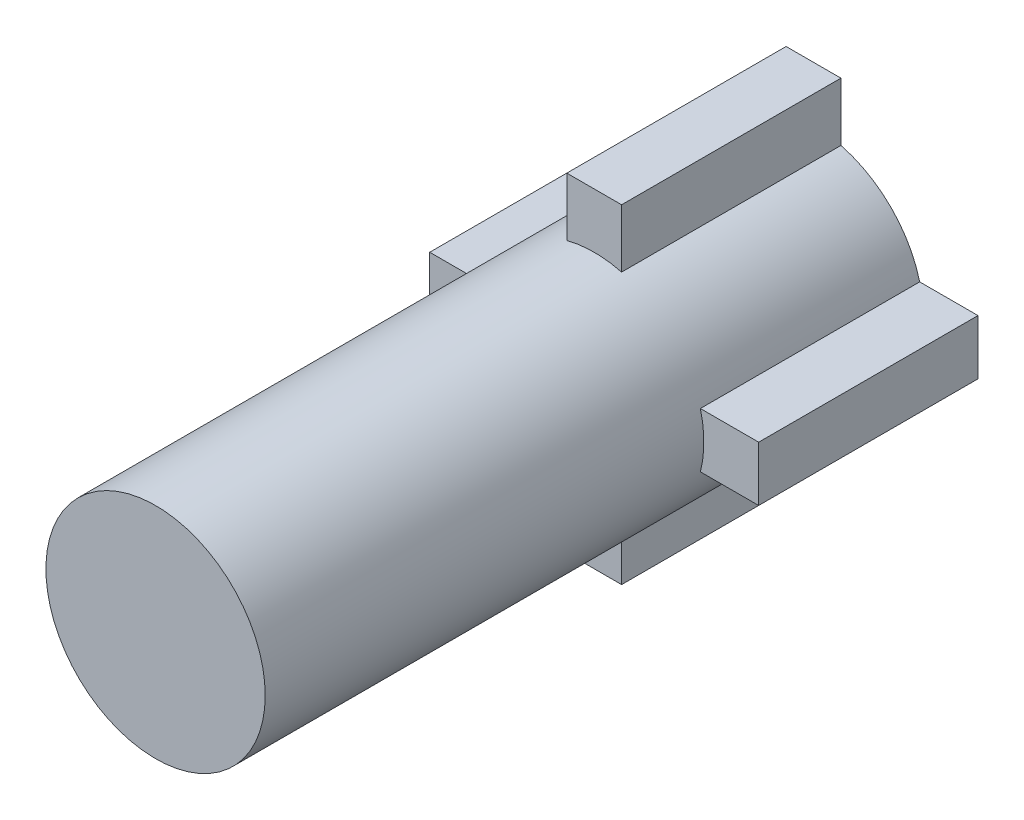
ISO-10303-21;
HEADER;
FILE_DESCRIPTION(('STEP AP214'),'2;1');
FILE_NAME('part.step','',(''),(''),'','','');
FILE_SCHEMA(('AUTOMOTIVE_DESIGN { 1 0 10303 214 1 1 1 1 }'));
ENDSEC;
DATA;
#1=APPLICATION_CONTEXT('core data for automotive mechanical design processes');
#2=APPLICATION_PROTOCOL_DEFINITION('international standard','automotive_design',2000,#1);
#3=PRODUCT_CONTEXT('',#1,'mechanical');
#4=PRODUCT('Part','Part','',(#3));
#5=PRODUCT_RELATED_PRODUCT_CATEGORY('part','',(#4));
#6=PRODUCT_DEFINITION_FORMATION('','',#4);
#7=PRODUCT_DEFINITION_CONTEXT('part definition',#1,'design');
#8=PRODUCT_DEFINITION('design','',#6,#7);
#9=PRODUCT_DEFINITION_SHAPE('','',#8);
#10=(LENGTH_UNIT() NAMED_UNIT(*) SI_UNIT(.MILLI.,.METRE.));
#11=(NAMED_UNIT(*) PLANE_ANGLE_UNIT() SI_UNIT($,.RADIAN.));
#12=(NAMED_UNIT(*) SI_UNIT($,.STERADIAN.) SOLID_ANGLE_UNIT());
#13=UNCERTAINTY_MEASURE_WITH_UNIT(LENGTH_MEASURE(1.E-05),#10,'distance_accuracy_value','');
#14=(GEOMETRIC_REPRESENTATION_CONTEXT(3) GLOBAL_UNCERTAINTY_ASSIGNED_CONTEXT((#13)) GLOBAL_UNIT_ASSIGNED_CONTEXT((#10,
#11,#12)) REPRESENTATION_CONTEXT('',''));
#15=CARTESIAN_POINT('',(0.,0.,0.));
#16=DIRECTION('',(0.,0.,1.));
#17=DIRECTION('',(1.,0.,0.));
#18=AXIS2_PLACEMENT_3D('',#15,#16,#17);
#19=CARTESIAN_POINT('',(0.,0.,0.3));
#20=DIRECTION('',(0.,0.,-1.));
#21=DIRECTION('',(-1.,0.,0.));
#22=AXIS2_PLACEMENT_3D('',#19,#20,#21);
#23=CYLINDRICAL_SURFACE('',#22,0.100000000000003);
#24=CARTESIAN_POINT('',(0.,0.,-0.3));
#25=DIRECTION('',(0.,0.,1.));
#26=DIRECTION('',(1.,0.,0.));
#27=AXIS2_PLACEMENT_3D('',#24,#25,#26);
#28=CIRCLE('',#27,0.100000000000003);
#29=CARTESIAN_POINT('',(-0.0968245836551884,-0.025,-0.3));
#30=VERTEX_POINT('',#29);
#31=CARTESIAN_POINT('',(-0.025,-0.0968245836551884,-0.3));
#32=VERTEX_POINT('',#31);
#33=EDGE_CURVE('E342',#30,#32,#28,.T.);
#34=ORIENTED_EDGE('',*,*,#33,.T.);
#35=DIRECTION('',(0.,0.,-1.));
#36=VECTOR('',#35,1.);
#37=CARTESIAN_POINT('',(-0.025,-0.0968245836551884,0.3));
#38=LINE('',#37,#36);
#39=CARTESIAN_POINT('',(-0.025,-0.0968245836551884,-0.1));
#40=VERTEX_POINT('',#39);
#41=EDGE_CURVE('E60',#32,#40,#38,.F.);
#42=ORIENTED_EDGE('',*,*,#41,.T.);
#43=CARTESIAN_POINT('',(0.,0.,-0.1));
#44=DIRECTION('',(0.,0.,-1.));
#45=DIRECTION('',(-1.,0.,0.));
#46=AXIS2_PLACEMENT_3D('',#43,#44,#45);
#47=CIRCLE('',#46,0.100000000000003);
#48=CARTESIAN_POINT('',(0.025,-0.0968245836551884,-0.1));
#49=VERTEX_POINT('',#48);
#50=EDGE_CURVE('E11',#49,#40,#47,.T.);
#51=ORIENTED_EDGE('',*,*,#50,.F.);
#52=DIRECTION('',(0.,0.,-1.));
#53=VECTOR('',#52,1.);
#54=CARTESIAN_POINT('',(0.025,-0.0968245836551884,0.3));
#55=LINE('',#54,#53);
#56=CARTESIAN_POINT('',(0.025,-0.0968245836551884,-0.3));
#57=VERTEX_POINT('',#56);
#58=EDGE_CURVE('E174',#49,#57,#55,.T.);
#59=ORIENTED_EDGE('',*,*,#58,.T.);
#60=CARTESIAN_POINT('',(0.0968245836551884,-0.025,-0.3));
#61=VERTEX_POINT('',#60);
#62=EDGE_CURVE('E306',#57,#61,#28,.T.);
#63=ORIENTED_EDGE('',*,*,#62,.T.);
#64=DIRECTION('',(0.,0.,-1.));
#65=VECTOR('',#64,1.);
#66=CARTESIAN_POINT('',(0.0968245836551884,-0.025,0.3));
#67=LINE('',#66,#65);
#68=CARTESIAN_POINT('',(0.0968245836551884,-0.025,-0.1));
#69=VERTEX_POINT('',#68);
#70=EDGE_CURVE('E303',#61,#69,#67,.F.);
#71=ORIENTED_EDGE('',*,*,#70,.T.);
#72=CARTESIAN_POINT('',(0.,0.,-0.1));
#73=DIRECTION('',(0.,0.,-1.));
#74=DIRECTION('',(-1.,0.,0.));
#75=AXIS2_PLACEMENT_3D('',#72,#73,#74);
#76=CIRCLE('',#75,0.100000000000003);
#77=CARTESIAN_POINT('',(0.0968245836551884,0.025,-0.1));
#78=VERTEX_POINT('',#77);
#79=EDGE_CURVE('E311',#78,#69,#76,.T.);
#80=ORIENTED_EDGE('',*,*,#79,.F.);
#81=DIRECTION('',(0.,0.,-1.));
#82=VECTOR('',#81,1.);
#83=CARTESIAN_POINT('',(0.0968245836551884,0.025,0.3));
#84=LINE('',#83,#82);
#85=CARTESIAN_POINT('',(0.0968245836551884,0.025,-0.3));
#86=VERTEX_POINT('',#85);
#87=EDGE_CURVE('E296',#78,#86,#84,.T.);
#88=ORIENTED_EDGE('',*,*,#87,.T.);
#89=CARTESIAN_POINT('',(0.025,0.0968245836551884,-0.3));
#90=VERTEX_POINT('',#89);
#91=EDGE_CURVE('E312',#86,#90,#28,.T.);
#92=ORIENTED_EDGE('',*,*,#91,.T.);
#93=DIRECTION('',(0.,0.,-1.));
#94=VECTOR('',#93,1.);
#95=CARTESIAN_POINT('',(0.025,0.0968245836551884,0.3));
#96=LINE('',#95,#94);
#97=CARTESIAN_POINT('',(0.025,0.0968245836551884,-0.1));
#98=VERTEX_POINT('',#97);
#99=EDGE_CURVE('E267',#90,#98,#96,.F.);
#100=ORIENTED_EDGE('',*,*,#99,.T.);
#101=CARTESIAN_POINT('',(0.,0.,-0.1));
#102=DIRECTION('',(0.,0.,-1.));
#103=DIRECTION('',(-1.,0.,0.));
#104=AXIS2_PLACEMENT_3D('',#101,#102,#103);
#105=CIRCLE('',#104,0.100000000000003);
#106=CARTESIAN_POINT('',(-0.025,0.0968245836551884,-0.1));
#107=VERTEX_POINT('',#106);
#108=EDGE_CURVE('E319',#107,#98,#105,.T.);
#109=ORIENTED_EDGE('',*,*,#108,.F.);
#110=DIRECTION('',(0.,0.,-1.));
#111=VECTOR('',#110,1.);
#112=CARTESIAN_POINT('',(-0.025,0.0968245836551884,0.3));
#113=LINE('',#112,#111);
#114=CARTESIAN_POINT('',(-0.025,0.0968245836551884,-0.3));
#115=VERTEX_POINT('',#114);
#116=EDGE_CURVE('E254',#107,#115,#113,.T.);
#117=ORIENTED_EDGE('',*,*,#116,.T.);
#118=CARTESIAN_POINT('',(-0.0968245836551884,0.025,-0.3));
#119=VERTEX_POINT('',#118);
#120=EDGE_CURVE('E315',#115,#119,#28,.T.);
#121=ORIENTED_EDGE('',*,*,#120,.T.);
#122=DIRECTION('',(0.,0.,-1.));
#123=VECTOR('',#122,1.);
#124=CARTESIAN_POINT('',(-0.0968245836551884,0.025,0.3));
#125=LINE('',#124,#123);
#126=CARTESIAN_POINT('',(-0.0968245836551884,0.025,-0.1));
#127=VERTEX_POINT('',#126);
#128=EDGE_CURVE('E231',#119,#127,#125,.F.);
#129=ORIENTED_EDGE('',*,*,#128,.T.);
#130=CARTESIAN_POINT('',(0.,0.,-0.1));
#131=DIRECTION('',(0.,0.,-1.));
#132=DIRECTION('',(-1.,0.,0.));
#133=AXIS2_PLACEMENT_3D('',#130,#131,#132);
#134=CIRCLE('',#133,0.100000000000003);
#135=CARTESIAN_POINT('',(-0.0968245836551884,-0.025,-0.1));
#136=VERTEX_POINT('',#135);
#137=EDGE_CURVE('E53',#136,#127,#134,.T.);
#138=ORIENTED_EDGE('',*,*,#137,.F.);
#139=DIRECTION('',(0.,0.,-1.));
#140=VECTOR('',#139,1.);
#141=CARTESIAN_POINT('',(-0.0968245836551884,-0.025,0.3));
#142=LINE('',#141,#140);
#143=EDGE_CURVE('E218',#136,#30,#142,.T.);
#144=ORIENTED_EDGE('',*,*,#143,.T.);
#145=EDGE_LOOP('',(#34,#42,#51,#59,#63,#71,#80,#88,#92,#100,#109,#117,#121,#129,#138,#144));
#146=FACE_BOUND('',#145,.T.);
#147=CARTESIAN_POINT('',(0.,0.,0.3));
#148=DIRECTION('',(0.,0.,1.));
#149=DIRECTION('',(1.,0.,0.));
#150=AXIS2_PLACEMENT_3D('',#147,#148,#149);
#151=CIRCLE('',#150,0.100000000000003);
#152=CARTESIAN_POINT('',(0.100000000000003,0.,0.3));
#153=VERTEX_POINT('',#152);
#154=EDGE_CURVE('E307',#153,#153,#151,.T.);
#155=ORIENTED_EDGE('',*,*,#154,.F.);
#156=EDGE_LOOP('',(#155));
#157=FACE_BOUND('',#156,.T.);
#158=ADVANCED_FACE('F45',(#146,#157),#23,.T.);
#159=CARTESIAN_POINT('',(0.,0.,0.3));
#160=DIRECTION('',(0.,0.,1.));
#161=DIRECTION('',(1.,0.,0.));
#162=AXIS2_PLACEMENT_3D('',#159,#160,#161);
#163=PLANE('',#162);
#164=ORIENTED_EDGE('',*,*,#154,.T.);
#165=EDGE_LOOP('',(#164));
#166=FACE_BOUND('',#165,.T.);
#167=ADVANCED_FACE('F372',(#166),#163,.T.);
#168=CARTESIAN_POINT('',(0.,0.,-0.3));
#169=DIRECTION('',(0.,0.,1.));
#170=DIRECTION('',(1.,0.,0.));
#171=AXIS2_PLACEMENT_3D('',#168,#169,#170);
#172=PLANE('',#171);
#173=ORIENTED_EDGE('',*,*,#62,.F.);
#174=DIRECTION('',(0.,-1.,0.));
#175=VECTOR('',#174,1.);
#176=CARTESIAN_POINT('',(0.025,-0.150000000000003,-0.3));
#177=LINE('',#176,#175);
#178=CARTESIAN_POINT('',(0.025,-0.150000000000003,-0.3));
#179=VERTEX_POINT('',#178);
#180=EDGE_CURVE('E175',#57,#179,#177,.T.);
#181=ORIENTED_EDGE('',*,*,#180,.T.);
#182=DIRECTION('',(-1.,0.,0.));
#183=VECTOR('',#182,1.);
#184=CARTESIAN_POINT('',(-0.0250000000000001,-0.150000000000003,-0.3));
#185=LINE('',#184,#183);
#186=CARTESIAN_POINT('',(-0.0250000000000001,-0.150000000000003,-0.3));
#187=VERTEX_POINT('',#186);
#188=EDGE_CURVE('E160',#179,#187,#185,.T.);
#189=ORIENTED_EDGE('',*,*,#188,.T.);
#190=DIRECTION('',(0.,1.,0.));
#191=VECTOR('',#190,1.);
#192=CARTESIAN_POINT('',(-0.0250000000000001,-0.150000000000003,-0.3));
#193=LINE('',#192,#191);
#194=EDGE_CURVE('E170',#187,#32,#193,.T.);
#195=ORIENTED_EDGE('',*,*,#194,.T.);
#196=ORIENTED_EDGE('',*,*,#33,.F.);
#197=DIRECTION('',(-1.,0.,0.));
#198=VECTOR('',#197,1.);
#199=CARTESIAN_POINT('',(-0.150000000000003,-0.025,-0.3));
#200=LINE('',#199,#198);
#201=CARTESIAN_POINT('',(-0.150000000000003,-0.025,-0.3));
#202=VERTEX_POINT('',#201);
#203=EDGE_CURVE('E210',#30,#202,#200,.T.);
#204=ORIENTED_EDGE('',*,*,#203,.T.);
#205=DIRECTION('',(0.,1.,0.));
#206=VECTOR('',#205,1.);
#207=CARTESIAN_POINT('',(-0.150000000000003,0.025,-0.3));
#208=LINE('',#207,#206);
#209=CARTESIAN_POINT('',(-0.150000000000003,0.025,-0.3));
#210=VERTEX_POINT('',#209);
#211=EDGE_CURVE('E206',#202,#210,#208,.T.);
#212=ORIENTED_EDGE('',*,*,#211,.T.);
#213=DIRECTION('',(1.,0.,0.));
#214=VECTOR('',#213,1.);
#215=CARTESIAN_POINT('',(-0.150000000000003,0.025,-0.3));
#216=LINE('',#215,#214);
#217=EDGE_CURVE('E214',#210,#119,#216,.T.);
#218=ORIENTED_EDGE('',*,*,#217,.T.);
#219=ORIENTED_EDGE('',*,*,#120,.F.);
#220=DIRECTION('',(0.,1.,0.));
#221=VECTOR('',#220,1.);
#222=CARTESIAN_POINT('',(-0.025,0.150000000000003,-0.3));
#223=LINE('',#222,#221);
#224=CARTESIAN_POINT('',(-0.025,0.150000000000003,-0.3));
#225=VERTEX_POINT('',#224);
#226=EDGE_CURVE('E246',#115,#225,#223,.T.);
#227=ORIENTED_EDGE('',*,*,#226,.T.);
#228=DIRECTION('',(1.,0.,0.));
#229=VECTOR('',#228,1.);
#230=CARTESIAN_POINT('',(0.025,0.150000000000003,-0.3));
#231=LINE('',#230,#229);
#232=CARTESIAN_POINT('',(0.025,0.150000000000003,-0.3));
#233=VERTEX_POINT('',#232);
#234=EDGE_CURVE('E242',#225,#233,#231,.T.);
#235=ORIENTED_EDGE('',*,*,#234,.T.);
#236=DIRECTION('',(0.,-1.,0.));
#237=VECTOR('',#236,1.);
#238=CARTESIAN_POINT('',(0.025,0.150000000000003,-0.3));
#239=LINE('',#238,#237);
#240=EDGE_CURVE('E250',#233,#90,#239,.T.);
#241=ORIENTED_EDGE('',*,*,#240,.T.);
#242=ORIENTED_EDGE('',*,*,#91,.F.);
#243=DIRECTION('',(1.,0.,0.));
#244=VECTOR('',#243,1.);
#245=CARTESIAN_POINT('',(0.150000000000003,0.025,-0.3));
#246=LINE('',#245,#244);
#247=CARTESIAN_POINT('',(0.150000000000003,0.025,-0.3));
#248=VERTEX_POINT('',#247);
#249=EDGE_CURVE('E287',#86,#248,#246,.T.);
#250=ORIENTED_EDGE('',*,*,#249,.T.);
#251=DIRECTION('',(0.,-1.,0.));
#252=VECTOR('',#251,1.);
#253=CARTESIAN_POINT('',(0.150000000000003,-0.025,-0.3));
#254=LINE('',#253,#252);
#255=CARTESIAN_POINT('',(0.150000000000003,-0.025,-0.3));
#256=VERTEX_POINT('',#255);
#257=EDGE_CURVE('E276',#248,#256,#254,.T.);
#258=ORIENTED_EDGE('',*,*,#257,.T.);
#259=DIRECTION('',(-1.,0.,0.));
#260=VECTOR('',#259,1.);
#261=CARTESIAN_POINT('',(0.150000000000003,-0.025,-0.3));
#262=LINE('',#261,#260);
#263=EDGE_CURVE('E270',#256,#61,#262,.T.);
#264=ORIENTED_EDGE('',*,*,#263,.T.);
#265=EDGE_LOOP('',(#173,#181,#189,#195,#196,#204,#212,#218,#219,#227,#235,#241,#242,#250,#258,#264));
#266=FACE_BOUND('',#265,.T.);
#267=ADVANCED_FACE('F177',(#266),#172,.F.);
#268=CARTESIAN_POINT('',(0.150000000000003,-0.025,-0.1));
#269=DIRECTION('',(0.,-1.,0.));
#270=DIRECTION('',(1.,0.,0.));
#271=AXIS2_PLACEMENT_3D('',#268,#269,#270);
#272=PLANE('',#271);
#273=ORIENTED_EDGE('',*,*,#70,.F.);
#274=ORIENTED_EDGE('',*,*,#263,.F.);
#275=DIRECTION('',(0.,0.,-1.));
#276=VECTOR('',#275,1.);
#277=CARTESIAN_POINT('',(0.150000000000003,-0.025,-0.1));
#278=LINE('',#277,#276);
#279=CARTESIAN_POINT('',(0.150000000000003,-0.025,-0.1));
#280=VERTEX_POINT('',#279);
#281=EDGE_CURVE('E293',#280,#256,#278,.T.);
#282=ORIENTED_EDGE('',*,*,#281,.F.);
#283=DIRECTION('',(-1.,0.,0.));
#284=VECTOR('',#283,1.);
#285=CARTESIAN_POINT('',(0.150000000000003,-0.025,-0.1));
#286=LINE('',#285,#284);
#287=EDGE_CURVE('E271',#280,#69,#286,.T.);
#288=ORIENTED_EDGE('',*,*,#287,.T.);
#289=EDGE_LOOP('',(#273,#274,#282,#288));
#290=FACE_BOUND('',#289,.T.);
#291=ADVANCED_FACE('F349',(#290),#272,.T.);
#292=CARTESIAN_POINT('',(0.150000000000003,0.025,-0.1));
#293=DIRECTION('',(0.,1.,0.));
#294=DIRECTION('',(0.,0.,1.));
#295=AXIS2_PLACEMENT_3D('',#292,#293,#294);
#296=PLANE('',#295);
#297=ORIENTED_EDGE('',*,*,#87,.F.);
#298=DIRECTION('',(1.,0.,0.));
#299=VECTOR('',#298,1.);
#300=CARTESIAN_POINT('',(0.150000000000003,0.025,-0.1));
#301=LINE('',#300,#299);
#302=CARTESIAN_POINT('',(0.150000000000003,0.025,-0.1));
#303=VERTEX_POINT('',#302);
#304=EDGE_CURVE('E275',#78,#303,#301,.T.);
#305=ORIENTED_EDGE('',*,*,#304,.T.);
#306=DIRECTION('',(0.,0.,-1.));
#307=VECTOR('',#306,1.);
#308=CARTESIAN_POINT('',(0.150000000000003,0.025,-0.1));
#309=LINE('',#308,#307);
#310=EDGE_CURVE('E283',#303,#248,#309,.T.);
#311=ORIENTED_EDGE('',*,*,#310,.T.);
#312=ORIENTED_EDGE('',*,*,#249,.F.);
#313=EDGE_LOOP('',(#297,#305,#311,#312));
#314=FACE_BOUND('',#313,.T.);
#315=ADVANCED_FACE('F362',(#314),#296,.T.);
#316=CARTESIAN_POINT('',(0.150000000000003,-0.025,-0.1));
#317=DIRECTION('',(1.,0.,0.));
#318=DIRECTION('',(0.,0.,-1.));
#319=AXIS2_PLACEMENT_3D('',#316,#317,#318);
#320=PLANE('',#319);
#321=ORIENTED_EDGE('',*,*,#257,.F.);
#322=ORIENTED_EDGE('',*,*,#310,.F.);
#323=DIRECTION('',(0.,-1.,0.));
#324=VECTOR('',#323,1.);
#325=CARTESIAN_POINT('',(0.150000000000003,-0.025,-0.1));
#326=LINE('',#325,#324);
#327=EDGE_CURVE('E279',#303,#280,#326,.T.);
#328=ORIENTED_EDGE('',*,*,#327,.T.);
#329=ORIENTED_EDGE('',*,*,#281,.T.);
#330=EDGE_LOOP('',(#321,#322,#328,#329));
#331=FACE_BOUND('',#330,.T.);
#332=ADVANCED_FACE('F355',(#331),#320,.T.);
#333=CARTESIAN_POINT('',(0.,0.,-0.1));
#334=DIRECTION('',(0.,0.,-1.));
#335=DIRECTION('',(-1.,0.,0.));
#336=AXIS2_PLACEMENT_3D('',#333,#334,#335);
#337=PLANE('',#336);
#338=ORIENTED_EDGE('',*,*,#304,.F.);
#339=ORIENTED_EDGE('',*,*,#79,.T.);
#340=ORIENTED_EDGE('',*,*,#287,.F.);
#341=ORIENTED_EDGE('',*,*,#327,.F.);
#342=EDGE_LOOP('',(#338,#339,#340,#341));
#343=FACE_BOUND('',#342,.T.);
#344=ADVANCED_FACE('F359',(#343),#337,.F.);
#345=CARTESIAN_POINT('',(0.025,0.150000000000003,-0.1));
#346=DIRECTION('',(1.,0.,0.));
#347=DIRECTION('',(0.,1.,0.));
#348=AXIS2_PLACEMENT_3D('',#345,#346,#347);
#349=PLANE('',#348);
#350=ORIENTED_EDGE('',*,*,#99,.F.);
#351=ORIENTED_EDGE('',*,*,#240,.F.);
#352=DIRECTION('',(0.,0.,-1.));
#353=VECTOR('',#352,1.);
#354=CARTESIAN_POINT('',(0.025,0.150000000000003,-0.1));
#355=LINE('',#354,#353);
#356=CARTESIAN_POINT('',(0.025,0.150000000000003,-0.1));
#357=VERTEX_POINT('',#356);
#358=EDGE_CURVE('E234',#357,#233,#355,.T.);
#359=ORIENTED_EDGE('',*,*,#358,.F.);
#360=DIRECTION('',(0.,-1.,0.));
#361=VECTOR('',#360,1.);
#362=CARTESIAN_POINT('',(0.025,0.150000000000003,-0.1));
#363=LINE('',#362,#361);
#364=EDGE_CURVE('E247',#357,#98,#363,.T.);
#365=ORIENTED_EDGE('',*,*,#364,.T.);
#366=EDGE_LOOP('',(#350,#351,#359,#365));
#367=FACE_BOUND('',#366,.T.);
#368=ADVANCED_FACE('F410',(#367),#349,.T.);
#369=CARTESIAN_POINT('',(-0.025,0.150000000000003,-0.1));
#370=DIRECTION('',(-1.,0.,0.));
#371=DIRECTION('',(0.,0.,1.));
#372=AXIS2_PLACEMENT_3D('',#369,#370,#371);
#373=PLANE('',#372);
#374=ORIENTED_EDGE('',*,*,#116,.F.);
#375=DIRECTION('',(0.,1.,0.));
#376=VECTOR('',#375,1.);
#377=CARTESIAN_POINT('',(-0.025,0.150000000000003,-0.1));
#378=LINE('',#377,#376);
#379=CARTESIAN_POINT('',(-0.025,0.150000000000003,-0.1));
#380=VERTEX_POINT('',#379);
#381=EDGE_CURVE('E258',#107,#380,#378,.T.);
#382=ORIENTED_EDGE('',*,*,#381,.T.);
#383=DIRECTION('',(0.,0.,-1.));
#384=VECTOR('',#383,1.);
#385=CARTESIAN_POINT('',(-0.025,0.150000000000003,-0.1));
#386=LINE('',#385,#384);
#387=EDGE_CURVE('E235',#380,#225,#386,.T.);
#388=ORIENTED_EDGE('',*,*,#387,.T.);
#389=ORIENTED_EDGE('',*,*,#226,.F.);
#390=EDGE_LOOP('',(#374,#382,#388,#389));
#391=FACE_BOUND('',#390,.T.);
#392=ADVANCED_FACE('F419',(#391),#373,.T.);
#393=CARTESIAN_POINT('',(0.025,0.150000000000003,-0.1));
#394=DIRECTION('',(0.,1.,0.));
#395=DIRECTION('',(0.,0.,1.));
#396=AXIS2_PLACEMENT_3D('',#393,#394,#395);
#397=PLANE('',#396);
#398=ORIENTED_EDGE('',*,*,#234,.F.);
#399=ORIENTED_EDGE('',*,*,#387,.F.);
#400=DIRECTION('',(1.,0.,0.));
#401=VECTOR('',#400,1.);
#402=CARTESIAN_POINT('',(0.025,0.150000000000003,-0.1));
#403=LINE('',#402,#401);
#404=EDGE_CURVE('E239',#380,#357,#403,.T.);
#405=ORIENTED_EDGE('',*,*,#404,.T.);
#406=ORIENTED_EDGE('',*,*,#358,.T.);
#407=EDGE_LOOP('',(#398,#399,#405,#406));
#408=FACE_BOUND('',#407,.T.);
#409=ADVANCED_FACE('F429',(#408),#397,.T.);
#410=CARTESIAN_POINT('',(0.,0.,-0.1));
#411=DIRECTION('',(0.,0.,-1.));
#412=DIRECTION('',(-1.,0.,0.));
#413=AXIS2_PLACEMENT_3D('',#410,#411,#412);
#414=PLANE('',#413);
#415=ORIENTED_EDGE('',*,*,#381,.F.);
#416=ORIENTED_EDGE('',*,*,#108,.T.);
#417=ORIENTED_EDGE('',*,*,#364,.F.);
#418=ORIENTED_EDGE('',*,*,#404,.F.);
#419=EDGE_LOOP('',(#415,#416,#417,#418));
#420=FACE_BOUND('',#419,.T.);
#421=ADVANCED_FACE('F439',(#420),#414,.F.);
#422=CARTESIAN_POINT('',(-0.150000000000003,0.025,-0.1));
#423=DIRECTION('',(0.,1.,0.));
#424=DIRECTION('',(-1.,0.,0.));
#425=AXIS2_PLACEMENT_3D('',#422,#423,#424);
#426=PLANE('',#425);
#427=ORIENTED_EDGE('',*,*,#128,.F.);
#428=ORIENTED_EDGE('',*,*,#217,.F.);
#429=DIRECTION('',(0.,0.,-1.));
#430=VECTOR('',#429,1.);
#431=CARTESIAN_POINT('',(-0.150000000000003,0.025,-0.1));
#432=LINE('',#431,#430);
#433=CARTESIAN_POINT('',(-0.150000000000003,0.025,-0.1));
#434=VERTEX_POINT('',#433);
#435=EDGE_CURVE('E198',#434,#210,#432,.T.);
#436=ORIENTED_EDGE('',*,*,#435,.F.);
#437=DIRECTION('',(1.,0.,0.));
#438=VECTOR('',#437,1.);
#439=CARTESIAN_POINT('',(-0.150000000000003,0.025,-0.1));
#440=LINE('',#439,#438);
#441=EDGE_CURVE('E211',#434,#127,#440,.T.);
#442=ORIENTED_EDGE('',*,*,#441,.T.);
#443=EDGE_LOOP('',(#427,#428,#436,#442));
#444=FACE_BOUND('',#443,.T.);
#445=ADVANCED_FACE('F332',(#444),#426,.T.);
#446=CARTESIAN_POINT('',(-0.150000000000003,-0.025,-0.1));
#447=DIRECTION('',(0.,-1.,0.));
#448=DIRECTION('',(0.,0.,-1.));
#449=AXIS2_PLACEMENT_3D('',#446,#447,#448);
#450=PLANE('',#449);
#451=ORIENTED_EDGE('',*,*,#143,.F.);
#452=DIRECTION('',(-1.,0.,0.));
#453=VECTOR('',#452,1.);
#454=CARTESIAN_POINT('',(-0.150000000000003,-0.025,-0.1));
#455=LINE('',#454,#453);
#456=CARTESIAN_POINT('',(-0.150000000000003,-0.025,-0.1));
#457=VERTEX_POINT('',#456);
#458=EDGE_CURVE('E222',#136,#457,#455,.T.);
#459=ORIENTED_EDGE('',*,*,#458,.T.);
#460=DIRECTION('',(0.,0.,-1.));
#461=VECTOR('',#460,1.);
#462=CARTESIAN_POINT('',(-0.150000000000003,-0.025,-0.1));
#463=LINE('',#462,#461);
#464=EDGE_CURVE('E199',#457,#202,#463,.T.);
#465=ORIENTED_EDGE('',*,*,#464,.T.);
#466=ORIENTED_EDGE('',*,*,#203,.F.);
#467=EDGE_LOOP('',(#451,#459,#465,#466));
#468=FACE_BOUND('',#467,.T.);
#469=ADVANCED_FACE('F340',(#468),#450,.T.);
#470=CARTESIAN_POINT('',(-0.150000000000003,0.025,-0.1));
#471=DIRECTION('',(-1.,0.,0.));
#472=DIRECTION('',(0.,0.,1.));
#473=AXIS2_PLACEMENT_3D('',#470,#471,#472);
#474=PLANE('',#473);
#475=ORIENTED_EDGE('',*,*,#211,.F.);
#476=ORIENTED_EDGE('',*,*,#464,.F.);
#477=DIRECTION('',(0.,1.,0.));
#478=VECTOR('',#477,1.);
#479=CARTESIAN_POINT('',(-0.150000000000003,0.025,-0.1));
#480=LINE('',#479,#478);
#481=EDGE_CURVE('E203',#457,#434,#480,.T.);
#482=ORIENTED_EDGE('',*,*,#481,.T.);
#483=ORIENTED_EDGE('',*,*,#435,.T.);
#484=EDGE_LOOP('',(#475,#476,#482,#483));
#485=FACE_BOUND('',#484,.T.);
#486=ADVANCED_FACE('F336',(#485),#474,.T.);
#487=CARTESIAN_POINT('',(0.,0.,-0.1));
#488=DIRECTION('',(0.,0.,-1.));
#489=DIRECTION('',(-1.,0.,0.));
#490=AXIS2_PLACEMENT_3D('',#487,#488,#489);
#491=PLANE('',#490);
#492=ORIENTED_EDGE('',*,*,#458,.F.);
#493=ORIENTED_EDGE('',*,*,#137,.T.);
#494=ORIENTED_EDGE('',*,*,#441,.F.);
#495=ORIENTED_EDGE('',*,*,#481,.F.);
#496=EDGE_LOOP('',(#492,#493,#494,#495));
#497=FACE_BOUND('',#496,.T.);
#498=ADVANCED_FACE('F327',(#497),#491,.F.);
#499=CARTESIAN_POINT('',(-0.0250000000000001,-0.150000000000003,-0.1));
#500=DIRECTION('',(-1.,0.,0.));
#501=DIRECTION('',(0.,-1.,0.));
#502=AXIS2_PLACEMENT_3D('',#499,#500,#501);
#503=PLANE('',#502);
#504=ORIENTED_EDGE('',*,*,#41,.F.);
#505=ORIENTED_EDGE('',*,*,#194,.F.);
#506=DIRECTION('',(0.,0.,-1.));
#507=VECTOR('',#506,1.);
#508=CARTESIAN_POINT('',(-0.0250000000000001,-0.150000000000003,-0.1));
#509=LINE('',#508,#507);
#510=CARTESIAN_POINT('',(-0.0250000000000001,-0.150000000000003,-0.1));
#511=VERTEX_POINT('',#510);
#512=EDGE_CURVE('E155',#511,#187,#509,.T.);
#513=ORIENTED_EDGE('',*,*,#512,.F.);
#514=DIRECTION('',(0.,1.,0.));
#515=VECTOR('',#514,1.);
#516=CARTESIAN_POINT('',(-0.0250000000000001,-0.150000000000003,-0.1));
#517=LINE('',#516,#515);
#518=EDGE_CURVE('E181',#511,#40,#517,.T.);
#519=ORIENTED_EDGE('',*,*,#518,.T.);
#520=EDGE_LOOP('',(#504,#505,#513,#519));
#521=FACE_BOUND('',#520,.T.);
#522=ADVANCED_FACE('F171',(#521),#503,.T.);
#523=CARTESIAN_POINT('',(0.025,-0.150000000000003,-0.1));
#524=DIRECTION('',(1.,0.,0.));
#525=DIRECTION('',(0.,1.,0.));
#526=AXIS2_PLACEMENT_3D('',#523,#524,#525);
#527=PLANE('',#526);
#528=ORIENTED_EDGE('',*,*,#58,.F.);
#529=DIRECTION('',(0.,-1.,0.));
#530=VECTOR('',#529,1.);
#531=CARTESIAN_POINT('',(0.025,-0.150000000000003,-0.1));
#532=LINE('',#531,#530);
#533=CARTESIAN_POINT('',(0.025,-0.150000000000003,-0.1));
#534=VERTEX_POINT('',#533);
#535=EDGE_CURVE('E186',#49,#534,#532,.T.);
#536=ORIENTED_EDGE('',*,*,#535,.T.);
#537=DIRECTION('',(0.,0.,-1.));
#538=VECTOR('',#537,1.);
#539=CARTESIAN_POINT('',(0.025,-0.150000000000003,-0.1));
#540=LINE('',#539,#538);
#541=EDGE_CURVE('E167',#534,#179,#540,.T.);
#542=ORIENTED_EDGE('',*,*,#541,.T.);
#543=ORIENTED_EDGE('',*,*,#180,.F.);
#544=EDGE_LOOP('',(#528,#536,#542,#543));
#545=FACE_BOUND('',#544,.T.);
#546=ADVANCED_FACE('F490',(#545),#527,.T.);
#547=CARTESIAN_POINT('',(-0.0250000000000001,-0.150000000000003,-0.1));
#548=DIRECTION('',(0.,-1.,0.));
#549=DIRECTION('',(0.,0.,-1.));
#550=AXIS2_PLACEMENT_3D('',#547,#548,#549);
#551=PLANE('',#550);
#552=ORIENTED_EDGE('',*,*,#188,.F.);
#553=ORIENTED_EDGE('',*,*,#541,.F.);
#554=DIRECTION('',(-1.,0.,0.));
#555=VECTOR('',#554,1.);
#556=CARTESIAN_POINT('',(-0.0250000000000001,-0.150000000000003,-0.1));
#557=LINE('',#556,#555);
#558=EDGE_CURVE('E162',#534,#511,#557,.T.);
#559=ORIENTED_EDGE('',*,*,#558,.T.);
#560=ORIENTED_EDGE('',*,*,#512,.T.);
#561=EDGE_LOOP('',(#552,#553,#559,#560));
#562=FACE_BOUND('',#561,.T.);
#563=ADVANCED_FACE('F157',(#562),#551,.T.);
#564=CARTESIAN_POINT('',(0.,0.,-0.1));
#565=DIRECTION('',(0.,0.,-1.));
#566=DIRECTION('',(-1.,0.,0.));
#567=AXIS2_PLACEMENT_3D('',#564,#565,#566);
#568=PLANE('',#567);
#569=ORIENTED_EDGE('',*,*,#535,.F.);
#570=ORIENTED_EDGE('',*,*,#50,.T.);
#571=ORIENTED_EDGE('',*,*,#518,.F.);
#572=ORIENTED_EDGE('',*,*,#558,.F.);
#573=EDGE_LOOP('',(#569,#570,#571,#572));
#574=FACE_BOUND('',#573,.T.);
#575=ADVANCED_FACE('F508',(#574),#568,.F.);
#576=CLOSED_SHELL('',(#158,#167,#267,#291,#315,#332,#344,#368,#392,#409,#421,#445,#469,#486,
#498,#522,#546,#563,#575));
#577=MANIFOLD_SOLID_BREP('B2',#576);
#578=ADVANCED_BREP_SHAPE_REPRESENTATION('',(#18,#577),#14);
#579=SHAPE_DEFINITION_REPRESENTATION(#9,#578);
ENDSEC;
END-ISO-10303-21;
